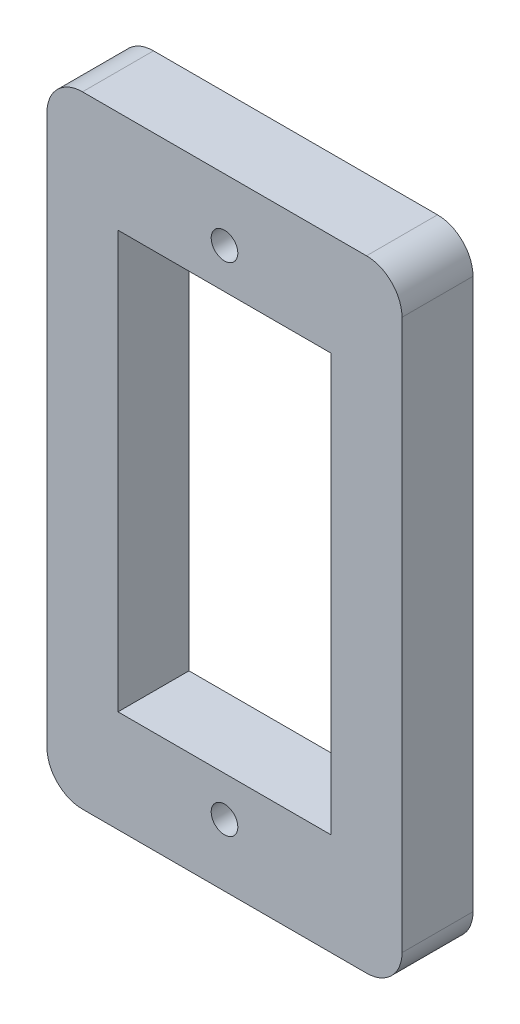
ISO-10303-21;
HEADER;
FILE_DESCRIPTION(('STEP AP214'),'2;1');
FILE_NAME('part.step','',(''),(''),'','','');
FILE_SCHEMA(('AUTOMOTIVE_DESIGN { 1 0 10303 214 1 1 1 1 }'));
ENDSEC;
DATA;
#1=APPLICATION_CONTEXT('core data for automotive mechanical design processes');
#2=APPLICATION_PROTOCOL_DEFINITION('international standard','automotive_design',2000,#1);
#3=PRODUCT_CONTEXT('',#1,'mechanical');
#4=PRODUCT('Part','Part','',(#3));
#5=PRODUCT_RELATED_PRODUCT_CATEGORY('part','',(#4));
#6=PRODUCT_DEFINITION_FORMATION('','',#4);
#7=PRODUCT_DEFINITION_CONTEXT('part definition',#1,'design');
#8=PRODUCT_DEFINITION('design','',#6,#7);
#9=PRODUCT_DEFINITION_SHAPE('','',#8);
#10=(LENGTH_UNIT() NAMED_UNIT(*) SI_UNIT(.MILLI.,.METRE.));
#11=(NAMED_UNIT(*) PLANE_ANGLE_UNIT() SI_UNIT($,.RADIAN.));
#12=(NAMED_UNIT(*) SI_UNIT($,.STERADIAN.) SOLID_ANGLE_UNIT());
#13=UNCERTAINTY_MEASURE_WITH_UNIT(LENGTH_MEASURE(1.E-05),#10,'distance_accuracy_value','');
#14=(GEOMETRIC_REPRESENTATION_CONTEXT(3) GLOBAL_UNCERTAINTY_ASSIGNED_CONTEXT((#13)) GLOBAL_UNIT_ASSIGNED_CONTEXT((#10,
#11,#12)) REPRESENTATION_CONTEXT('',''));
#15=CARTESIAN_POINT('',(0.,0.,0.));
#16=DIRECTION('',(0.,0.,1.));
#17=DIRECTION('',(1.,0.,0.));
#18=AXIS2_PLACEMENT_3D('',#15,#16,#17);
#19=CARTESIAN_POINT('',(0.,0.,4.));
#20=DIRECTION('',(0.,0.,1.));
#21=DIRECTION('',(1.,0.,0.));
#22=AXIS2_PLACEMENT_3D('',#19,#20,#21);
#23=PLANE('',#22);
#24=CARTESIAN_POINT('',(0.,14.,4.));
#25=DIRECTION('',(0.,0.,1.));
#26=DIRECTION('',(1.,0.,0.));
#27=AXIS2_PLACEMENT_3D('',#24,#25,#26);
#28=CIRCLE('',#27,0.75);
#29=CARTESIAN_POINT('',(0.75,14.,4.));
#30=VERTEX_POINT('',#29);
#31=EDGE_CURVE('E441',#30,#30,#28,.T.);
#32=ORIENTED_EDGE('',*,*,#31,.F.);
#33=EDGE_LOOP('',(#32));
#34=FACE_BOUND('',#33,.T.);
#35=CARTESIAN_POINT('',(0.,-14.,4.));
#36=DIRECTION('',(0.,0.,1.));
#37=DIRECTION('',(-1.,0.,0.));
#38=AXIS2_PLACEMENT_3D('',#35,#36,#37);
#39=CIRCLE('',#38,0.75);
#40=CARTESIAN_POINT('',(-0.75,-14.,4.));
#41=VERTEX_POINT('',#40);
#42=EDGE_CURVE('E438',#41,#41,#39,.T.);
#43=ORIENTED_EDGE('',*,*,#42,.F.);
#44=EDGE_LOOP('',(#43));
#45=FACE_BOUND('',#44,.T.);
#46=DIRECTION('',(1.,0.,0.));
#47=VECTOR('',#46,1.);
#48=CARTESIAN_POINT('',(-10.,-17.5,4.));
#49=LINE('',#48,#47);
#50=CARTESIAN_POINT('',(-8.,-17.5,4.));
#51=VERTEX_POINT('',#50);
#52=CARTESIAN_POINT('',(8.,-17.5,4.));
#53=VERTEX_POINT('',#52);
#54=EDGE_CURVE('E197',#51,#53,#49,.T.);
#55=ORIENTED_EDGE('',*,*,#54,.T.);
#56=CARTESIAN_POINT('',(8.,-15.5,4.));
#57=DIRECTION('',(0.,0.,1.));
#58=DIRECTION('',(1.,0.,0.));
#59=AXIS2_PLACEMENT_3D('',#56,#57,#58);
#60=CIRCLE('',#59,2.);
#61=CARTESIAN_POINT('',(10.,-15.5,4.));
#62=VERTEX_POINT('',#61);
#63=EDGE_CURVE('E248',#53,#62,#60,.T.);
#64=ORIENTED_EDGE('',*,*,#63,.T.);
#65=DIRECTION('',(0.,1.,0.));
#66=VECTOR('',#65,1.);
#67=CARTESIAN_POINT('',(10.,17.5,4.));
#68=LINE('',#67,#66);
#69=CARTESIAN_POINT('',(10.,15.5,4.));
#70=VERTEX_POINT('',#69);
#71=EDGE_CURVE('E186',#62,#70,#68,.T.);
#72=ORIENTED_EDGE('',*,*,#71,.T.);
#73=CARTESIAN_POINT('',(8.,15.5,4.));
#74=DIRECTION('',(0.,0.,1.));
#75=DIRECTION('',(1.,0.,0.));
#76=AXIS2_PLACEMENT_3D('',#73,#74,#75);
#77=CIRCLE('',#76,2.);
#78=CARTESIAN_POINT('',(8.,17.5,4.));
#79=VERTEX_POINT('',#78);
#80=EDGE_CURVE('E240',#70,#79,#77,.T.);
#81=ORIENTED_EDGE('',*,*,#80,.T.);
#82=DIRECTION('',(-1.,0.,0.));
#83=VECTOR('',#82,1.);
#84=CARTESIAN_POINT('',(-10.,17.5,4.));
#85=LINE('',#84,#83);
#86=CARTESIAN_POINT('',(-8.,17.5,4.));
#87=VERTEX_POINT('',#86);
#88=EDGE_CURVE('E190',#79,#87,#85,.T.);
#89=ORIENTED_EDGE('',*,*,#88,.T.);
#90=CARTESIAN_POINT('',(-8.,15.5,4.));
#91=DIRECTION('',(0.,0.,1.));
#92=DIRECTION('',(1.,0.,0.));
#93=AXIS2_PLACEMENT_3D('',#90,#91,#92);
#94=CIRCLE('',#93,2.);
#95=CARTESIAN_POINT('',(-10.,15.5,4.));
#96=VERTEX_POINT('',#95);
#97=EDGE_CURVE('E62',#87,#96,#94,.T.);
#98=ORIENTED_EDGE('',*,*,#97,.T.);
#99=DIRECTION('',(0.,-1.,0.));
#100=VECTOR('',#99,1.);
#101=CARTESIAN_POINT('',(-10.,17.5,4.));
#102=LINE('',#101,#100);
#103=CARTESIAN_POINT('',(-10.,-15.5,4.));
#104=VERTEX_POINT('',#103);
#105=EDGE_CURVE('E194',#96,#104,#102,.T.);
#106=ORIENTED_EDGE('',*,*,#105,.T.);
#107=CARTESIAN_POINT('',(-8.,-15.5,4.));
#108=DIRECTION('',(0.,0.,1.));
#109=DIRECTION('',(1.,0.,0.));
#110=AXIS2_PLACEMENT_3D('',#107,#108,#109);
#111=CIRCLE('',#110,2.);
#112=EDGE_CURVE('E245',#104,#51,#111,.T.);
#113=ORIENTED_EDGE('',*,*,#112,.T.);
#114=EDGE_LOOP('',(#55,#64,#72,#81,#89,#98,#106,#113));
#115=FACE_BOUND('',#114,.T.);
#116=DIRECTION('',(-1.,0.,0.));
#117=VECTOR('',#116,1.);
#118=CARTESIAN_POINT('',(-6.,11.75,4.));
#119=LINE('',#118,#117);
#120=CARTESIAN_POINT('',(6.,11.75,4.));
#121=VERTEX_POINT('',#120);
#122=CARTESIAN_POINT('',(-6.,11.75,4.));
#123=VERTEX_POINT('',#122);
#124=EDGE_CURVE('E142',#121,#123,#119,.T.);
#125=ORIENTED_EDGE('',*,*,#124,.F.);
#126=DIRECTION('',(0.,1.,0.));
#127=VECTOR('',#126,1.);
#128=CARTESIAN_POINT('',(6.,11.75,4.));
#129=LINE('',#128,#127);
#130=CARTESIAN_POINT('',(6.,-11.75,4.));
#131=VERTEX_POINT('',#130);
#132=EDGE_CURVE('E131',#131,#121,#129,.T.);
#133=ORIENTED_EDGE('',*,*,#132,.F.);
#134=DIRECTION('',(1.,0.,0.));
#135=VECTOR('',#134,1.);
#136=CARTESIAN_POINT('',(-6.,-11.75,4.));
#137=LINE('',#136,#135);
#138=CARTESIAN_POINT('',(-6.,-11.75,4.));
#139=VERTEX_POINT('',#138);
#140=EDGE_CURVE('E160',#139,#131,#137,.T.);
#141=ORIENTED_EDGE('',*,*,#140,.F.);
#142=DIRECTION('',(0.,-1.,0.));
#143=VECTOR('',#142,1.);
#144=CARTESIAN_POINT('',(-6.,11.75,4.));
#145=LINE('',#144,#143);
#146=EDGE_CURVE('E156',#123,#139,#145,.T.);
#147=ORIENTED_EDGE('',*,*,#146,.F.);
#148=EDGE_LOOP('',(#125,#133,#141,#147));
#149=FACE_BOUND('',#148,.T.);
#150=ADVANCED_FACE('F39',(#34,#45,#115,#149),#23,.T.);
#151=CARTESIAN_POINT('',(0.,0.,0.));
#152=DIRECTION('',(0.,0.,1.));
#153=DIRECTION('',(1.,0.,0.));
#154=AXIS2_PLACEMENT_3D('',#151,#152,#153);
#155=PLANE('',#154);
#156=CARTESIAN_POINT('',(0.,14.,0.));
#157=DIRECTION('',(0.,0.,1.));
#158=DIRECTION('',(1.,0.,0.));
#159=AXIS2_PLACEMENT_3D('',#156,#157,#158);
#160=CIRCLE('',#159,0.75);
#161=CARTESIAN_POINT('',(0.75,14.,0.));
#162=VERTEX_POINT('',#161);
#163=EDGE_CURVE('E169',#162,#162,#160,.T.);
#164=ORIENTED_EDGE('',*,*,#163,.T.);
#165=EDGE_LOOP('',(#164));
#166=FACE_BOUND('',#165,.T.);
#167=CARTESIAN_POINT('',(0.,-14.,0.));
#168=DIRECTION('',(0.,0.,1.));
#169=DIRECTION('',(-1.,0.,0.));
#170=AXIS2_PLACEMENT_3D('',#167,#168,#169);
#171=CIRCLE('',#170,0.75);
#172=CARTESIAN_POINT('',(-0.75,-14.,0.));
#173=VERTEX_POINT('',#172);
#174=EDGE_CURVE('E435',#173,#173,#171,.T.);
#175=ORIENTED_EDGE('',*,*,#174,.T.);
#176=EDGE_LOOP('',(#175));
#177=FACE_BOUND('',#176,.T.);
#178=DIRECTION('',(0.,1.,0.));
#179=VECTOR('',#178,1.);
#180=CARTESIAN_POINT('',(10.,17.5,0.));
#181=LINE('',#180,#179);
#182=CARTESIAN_POINT('',(10.,-15.5,0.));
#183=VERTEX_POINT('',#182);
#184=CARTESIAN_POINT('',(10.,15.5,0.));
#185=VERTEX_POINT('',#184);
#186=EDGE_CURVE('E151',#183,#185,#181,.T.);
#187=ORIENTED_EDGE('',*,*,#186,.F.);
#188=CARTESIAN_POINT('',(8.,-15.5,0.));
#189=DIRECTION('',(0.,0.,1.));
#190=DIRECTION('',(1.,0.,0.));
#191=AXIS2_PLACEMENT_3D('',#188,#189,#190);
#192=CIRCLE('',#191,2.);
#193=CARTESIAN_POINT('',(8.,-17.5,0.));
#194=VERTEX_POINT('',#193);
#195=EDGE_CURVE('E230',#183,#194,#192,.F.);
#196=ORIENTED_EDGE('',*,*,#195,.T.);
#197=DIRECTION('',(1.,0.,0.));
#198=VECTOR('',#197,1.);
#199=CARTESIAN_POINT('',(-10.,-17.5,0.));
#200=LINE('',#199,#198);
#201=CARTESIAN_POINT('',(-8.,-17.5,0.));
#202=VERTEX_POINT('',#201);
#203=EDGE_CURVE('E191',#202,#194,#200,.T.);
#204=ORIENTED_EDGE('',*,*,#203,.F.);
#205=CARTESIAN_POINT('',(-8.,-15.5,0.));
#206=DIRECTION('',(0.,0.,1.));
#207=DIRECTION('',(1.,0.,0.));
#208=AXIS2_PLACEMENT_3D('',#205,#206,#207);
#209=CIRCLE('',#208,2.);
#210=CARTESIAN_POINT('',(-10.,-15.5,0.));
#211=VERTEX_POINT('',#210);
#212=EDGE_CURVE('E227',#202,#211,#209,.F.);
#213=ORIENTED_EDGE('',*,*,#212,.T.);
#214=DIRECTION('',(0.,-1.,0.));
#215=VECTOR('',#214,1.);
#216=CARTESIAN_POINT('',(-10.,17.5,0.));
#217=LINE('',#216,#215);
#218=CARTESIAN_POINT('',(-10.,15.5,0.));
#219=VERTEX_POINT('',#218);
#220=EDGE_CURVE('E209',#219,#211,#217,.T.);
#221=ORIENTED_EDGE('',*,*,#220,.F.);
#222=CARTESIAN_POINT('',(-8.,15.5,0.));
#223=DIRECTION('',(0.,0.,1.));
#224=DIRECTION('',(1.,0.,0.));
#225=AXIS2_PLACEMENT_3D('',#222,#223,#224);
#226=CIRCLE('',#225,2.);
#227=CARTESIAN_POINT('',(-8.,17.5,0.));
#228=VERTEX_POINT('',#227);
#229=EDGE_CURVE('E224',#219,#228,#226,.F.);
#230=ORIENTED_EDGE('',*,*,#229,.T.);
#231=DIRECTION('',(-1.,0.,0.));
#232=VECTOR('',#231,1.);
#233=CARTESIAN_POINT('',(-10.,17.5,0.));
#234=LINE('',#233,#232);
#235=CARTESIAN_POINT('',(8.,17.5,0.));
#236=VERTEX_POINT('',#235);
#237=EDGE_CURVE('E205',#236,#228,#234,.T.);
#238=ORIENTED_EDGE('',*,*,#237,.F.);
#239=CARTESIAN_POINT('',(8.,15.5,0.));
#240=DIRECTION('',(0.,0.,1.));
#241=DIRECTION('',(1.,0.,0.));
#242=AXIS2_PLACEMENT_3D('',#239,#240,#241);
#243=CIRCLE('',#242,2.);
#244=EDGE_CURVE('E221',#236,#185,#243,.F.);
#245=ORIENTED_EDGE('',*,*,#244,.T.);
#246=EDGE_LOOP('',(#187,#196,#204,#213,#221,#230,#238,#245));
#247=FACE_BOUND('',#246,.T.);
#248=DIRECTION('',(0.,1.,0.));
#249=VECTOR('',#248,1.);
#250=CARTESIAN_POINT('',(6.,11.75,0.));
#251=LINE('',#250,#249);
#252=CARTESIAN_POINT('',(6.,-11.75,0.));
#253=VERTEX_POINT('',#252);
#254=CARTESIAN_POINT('',(6.,11.75,0.));
#255=VERTEX_POINT('',#254);
#256=EDGE_CURVE('E166',#253,#255,#251,.T.);
#257=ORIENTED_EDGE('',*,*,#256,.T.);
#258=DIRECTION('',(-1.,0.,0.));
#259=VECTOR('',#258,1.);
#260=CARTESIAN_POINT('',(-6.,11.75,0.));
#261=LINE('',#260,#259);
#262=CARTESIAN_POINT('',(-6.,11.75,0.));
#263=VERTEX_POINT('',#262);
#264=EDGE_CURVE('E149',#255,#263,#261,.T.);
#265=ORIENTED_EDGE('',*,*,#264,.T.);
#266=DIRECTION('',(0.,-1.,0.));
#267=VECTOR('',#266,1.);
#268=CARTESIAN_POINT('',(-6.,11.75,0.));
#269=LINE('',#268,#267);
#270=CARTESIAN_POINT('',(-6.,-11.75,0.));
#271=VERTEX_POINT('',#270);
#272=EDGE_CURVE('E172',#263,#271,#269,.T.);
#273=ORIENTED_EDGE('',*,*,#272,.T.);
#274=DIRECTION('',(1.,0.,0.));
#275=VECTOR('',#274,1.);
#276=CARTESIAN_POINT('',(-6.,-11.75,0.));
#277=LINE('',#276,#275);
#278=EDGE_CURVE('E143',#271,#253,#277,.T.);
#279=ORIENTED_EDGE('',*,*,#278,.T.);
#280=EDGE_LOOP('',(#257,#265,#273,#279));
#281=FACE_BOUND('',#280,.T.);
#282=ADVANCED_FACE('F268',(#166,#177,#247,#281),#155,.F.);
#283=CARTESIAN_POINT('',(10.,17.5,4.));
#284=DIRECTION('',(-1.,0.,0.));
#285=DIRECTION('',(0.,-1.,0.));
#286=AXIS2_PLACEMENT_3D('',#283,#284,#285);
#287=PLANE('',#286);
#288=ORIENTED_EDGE('',*,*,#71,.F.);
#289=DIRECTION('',(0.,0.,-1.));
#290=VECTOR('',#289,1.);
#291=CARTESIAN_POINT('',(10.,-15.5,4.));
#292=LINE('',#291,#290);
#293=EDGE_CURVE('E217',#62,#183,#292,.T.);
#294=ORIENTED_EDGE('',*,*,#293,.T.);
#295=ORIENTED_EDGE('',*,*,#186,.T.);
#296=DIRECTION('',(0.,0.,-1.));
#297=VECTOR('',#296,1.);
#298=CARTESIAN_POINT('',(10.,15.5,4.));
#299=LINE('',#298,#297);
#300=EDGE_CURVE('E201',#185,#70,#299,.F.);
#301=ORIENTED_EDGE('',*,*,#300,.T.);
#302=EDGE_LOOP('',(#288,#294,#295,#301));
#303=FACE_BOUND('',#302,.T.);
#304=ADVANCED_FACE('F290',(#303),#287,.F.);
#305=CARTESIAN_POINT('',(-10.,17.5,4.));
#306=DIRECTION('',(0.,-1.,0.));
#307=DIRECTION('',(0.,0.,-1.));
#308=AXIS2_PLACEMENT_3D('',#305,#306,#307);
#309=PLANE('',#308);
#310=ORIENTED_EDGE('',*,*,#237,.T.);
#311=DIRECTION('',(0.,0.,-1.));
#312=VECTOR('',#311,1.);
#313=CARTESIAN_POINT('',(-8.,17.5,4.));
#314=LINE('',#313,#312);
#315=EDGE_CURVE('E11',#228,#87,#314,.F.);
#316=ORIENTED_EDGE('',*,*,#315,.T.);
#317=ORIENTED_EDGE('',*,*,#88,.F.);
#318=DIRECTION('',(0.,0.,-1.));
#319=VECTOR('',#318,1.);
#320=CARTESIAN_POINT('',(8.,17.5,4.));
#321=LINE('',#320,#319);
#322=EDGE_CURVE('E48',#79,#236,#321,.T.);
#323=ORIENTED_EDGE('',*,*,#322,.T.);
#324=EDGE_LOOP('',(#310,#316,#317,#323));
#325=FACE_BOUND('',#324,.T.);
#326=ADVANCED_FACE('F262',(#325),#309,.F.);
#327=CARTESIAN_POINT('',(-10.,17.5,4.));
#328=DIRECTION('',(1.,0.,0.));
#329=DIRECTION('',(0.,1.,0.));
#330=AXIS2_PLACEMENT_3D('',#327,#328,#329);
#331=PLANE('',#330);
#332=ORIENTED_EDGE('',*,*,#220,.T.);
#333=DIRECTION('',(0.,0.,-1.));
#334=VECTOR('',#333,1.);
#335=CARTESIAN_POINT('',(-10.,-15.5,4.));
#336=LINE('',#335,#334);
#337=EDGE_CURVE('E55',#211,#104,#336,.F.);
#338=ORIENTED_EDGE('',*,*,#337,.T.);
#339=ORIENTED_EDGE('',*,*,#105,.F.);
#340=DIRECTION('',(0.,0.,-1.));
#341=VECTOR('',#340,1.);
#342=CARTESIAN_POINT('',(-10.,15.5,4.));
#343=LINE('',#342,#341);
#344=EDGE_CURVE('E251',#96,#219,#343,.T.);
#345=ORIENTED_EDGE('',*,*,#344,.T.);
#346=EDGE_LOOP('',(#332,#338,#339,#345));
#347=FACE_BOUND('',#346,.T.);
#348=ADVANCED_FACE('F274',(#347),#331,.F.);
#349=CARTESIAN_POINT('',(-10.,-17.5,4.));
#350=DIRECTION('',(0.,1.,0.));
#351=DIRECTION('',(0.,0.,1.));
#352=AXIS2_PLACEMENT_3D('',#349,#350,#351);
#353=PLANE('',#352);
#354=ORIENTED_EDGE('',*,*,#203,.T.);
#355=DIRECTION('',(0.,0.,-1.));
#356=VECTOR('',#355,1.);
#357=CARTESIAN_POINT('',(8.,-17.5,4.));
#358=LINE('',#357,#356);
#359=EDGE_CURVE('E237',#194,#53,#358,.F.);
#360=ORIENTED_EDGE('',*,*,#359,.T.);
#361=ORIENTED_EDGE('',*,*,#54,.F.);
#362=DIRECTION('',(0.,0.,-1.));
#363=VECTOR('',#362,1.);
#364=CARTESIAN_POINT('',(-8.,-17.5,4.));
#365=LINE('',#364,#363);
#366=EDGE_CURVE('E233',#51,#202,#365,.T.);
#367=ORIENTED_EDGE('',*,*,#366,.T.);
#368=EDGE_LOOP('',(#354,#360,#361,#367));
#369=FACE_BOUND('',#368,.T.);
#370=ADVANCED_FACE('F282',(#369),#353,.F.);
#371=CARTESIAN_POINT('',(6.,11.75,4.));
#372=DIRECTION('',(-1.,0.,0.));
#373=DIRECTION('',(0.,-1.,0.));
#374=AXIS2_PLACEMENT_3D('',#371,#372,#373);
#375=PLANE('',#374);
#376=ORIENTED_EDGE('',*,*,#256,.F.);
#377=DIRECTION('',(0.,0.,-1.));
#378=VECTOR('',#377,1.);
#379=CARTESIAN_POINT('',(6.,-11.75,4.));
#380=LINE('',#379,#378);
#381=EDGE_CURVE('E137',#131,#253,#380,.T.);
#382=ORIENTED_EDGE('',*,*,#381,.F.);
#383=ORIENTED_EDGE('',*,*,#132,.T.);
#384=DIRECTION('',(0.,0.,-1.));
#385=VECTOR('',#384,1.);
#386=CARTESIAN_POINT('',(6.,11.75,4.));
#387=LINE('',#386,#385);
#388=EDGE_CURVE('E134',#121,#255,#387,.T.);
#389=ORIENTED_EDGE('',*,*,#388,.T.);
#390=EDGE_LOOP('',(#376,#382,#383,#389));
#391=FACE_BOUND('',#390,.T.);
#392=ADVANCED_FACE('F133',(#391),#375,.T.);
#393=CARTESIAN_POINT('',(-6.,11.75,4.));
#394=DIRECTION('',(0.,-1.,0.));
#395=DIRECTION('',(1.,0.,0.));
#396=AXIS2_PLACEMENT_3D('',#393,#394,#395);
#397=PLANE('',#396);
#398=ORIENTED_EDGE('',*,*,#264,.F.);
#399=ORIENTED_EDGE('',*,*,#388,.F.);
#400=ORIENTED_EDGE('',*,*,#124,.T.);
#401=DIRECTION('',(0.,0.,-1.));
#402=VECTOR('',#401,1.);
#403=CARTESIAN_POINT('',(-6.,11.75,4.));
#404=LINE('',#403,#402);
#405=EDGE_CURVE('E152',#123,#263,#404,.T.);
#406=ORIENTED_EDGE('',*,*,#405,.T.);
#407=EDGE_LOOP('',(#398,#399,#400,#406));
#408=FACE_BOUND('',#407,.T.);
#409=ADVANCED_FACE('F146',(#408),#397,.T.);
#410=CARTESIAN_POINT('',(-6.,11.75,4.));
#411=DIRECTION('',(1.,0.,0.));
#412=DIRECTION('',(0.,1.,0.));
#413=AXIS2_PLACEMENT_3D('',#410,#411,#412);
#414=PLANE('',#413);
#415=ORIENTED_EDGE('',*,*,#272,.F.);
#416=ORIENTED_EDGE('',*,*,#405,.F.);
#417=ORIENTED_EDGE('',*,*,#146,.T.);
#418=DIRECTION('',(0.,0.,-1.));
#419=VECTOR('',#418,1.);
#420=CARTESIAN_POINT('',(-6.,-11.75,4.));
#421=LINE('',#420,#419);
#422=EDGE_CURVE('E181',#139,#271,#421,.T.);
#423=ORIENTED_EDGE('',*,*,#422,.T.);
#424=EDGE_LOOP('',(#415,#416,#417,#423));
#425=FACE_BOUND('',#424,.T.);
#426=ADVANCED_FACE('F368',(#425),#414,.T.);
#427=CARTESIAN_POINT('',(-6.,-11.75,4.));
#428=DIRECTION('',(0.,1.,0.));
#429=DIRECTION('',(0.,0.,1.));
#430=AXIS2_PLACEMENT_3D('',#427,#428,#429);
#431=PLANE('',#430);
#432=ORIENTED_EDGE('',*,*,#278,.F.);
#433=ORIENTED_EDGE('',*,*,#422,.F.);
#434=ORIENTED_EDGE('',*,*,#140,.T.);
#435=ORIENTED_EDGE('',*,*,#381,.T.);
#436=EDGE_LOOP('',(#432,#433,#434,#435));
#437=FACE_BOUND('',#436,.T.);
#438=ADVANCED_FACE('F359',(#437),#431,.T.);
#439=CARTESIAN_POINT('',(0.,-14.,0.));
#440=DIRECTION('',(0.,0.,1.));
#441=DIRECTION('',(1.,0.,0.));
#442=AXIS2_PLACEMENT_3D('',#439,#440,#441);
#443=CYLINDRICAL_SURFACE('',#442,0.75);
#444=ORIENTED_EDGE('',*,*,#174,.F.);
#445=EDGE_LOOP('',(#444));
#446=FACE_BOUND('',#445,.T.);
#447=ORIENTED_EDGE('',*,*,#42,.T.);
#448=EDGE_LOOP('',(#447));
#449=FACE_BOUND('',#448,.T.);
#450=ADVANCED_FACE('F350',(#446,#449),#443,.F.);
#451=CARTESIAN_POINT('',(0.,14.,0.));
#452=DIRECTION('',(0.,0.,1.));
#453=DIRECTION('',(1.,0.,0.));
#454=AXIS2_PLACEMENT_3D('',#451,#452,#453);
#455=CYLINDRICAL_SURFACE('',#454,0.75);
#456=ORIENTED_EDGE('',*,*,#163,.F.);
#457=EDGE_LOOP('',(#456));
#458=FACE_BOUND('',#457,.T.);
#459=ORIENTED_EDGE('',*,*,#31,.T.);
#460=EDGE_LOOP('',(#459));
#461=FACE_BOUND('',#460,.T.);
#462=ADVANCED_FACE('F319',(#458,#461),#455,.F.);
#463=CARTESIAN_POINT('',(8.,-15.5,4.));
#464=DIRECTION('',(0.,0.,-1.));
#465=DIRECTION('',(-1.,0.,0.));
#466=AXIS2_PLACEMENT_3D('',#463,#464,#465);
#467=CYLINDRICAL_SURFACE('',#466,2.);
#468=ORIENTED_EDGE('',*,*,#63,.F.);
#469=ORIENTED_EDGE('',*,*,#359,.F.);
#470=ORIENTED_EDGE('',*,*,#195,.F.);
#471=ORIENTED_EDGE('',*,*,#293,.F.);
#472=EDGE_LOOP('',(#468,#469,#470,#471));
#473=FACE_BOUND('',#472,.T.);
#474=ADVANCED_FACE('F287',(#473),#467,.T.);
#475=CARTESIAN_POINT('',(-8.,-15.5,4.));
#476=DIRECTION('',(0.,0.,-1.));
#477=DIRECTION('',(-1.,0.,0.));
#478=AXIS2_PLACEMENT_3D('',#475,#476,#477);
#479=CYLINDRICAL_SURFACE('',#478,2.);
#480=ORIENTED_EDGE('',*,*,#112,.F.);
#481=ORIENTED_EDGE('',*,*,#337,.F.);
#482=ORIENTED_EDGE('',*,*,#212,.F.);
#483=ORIENTED_EDGE('',*,*,#366,.F.);
#484=EDGE_LOOP('',(#480,#481,#482,#483));
#485=FACE_BOUND('',#484,.T.);
#486=ADVANCED_FACE('F279',(#485),#479,.T.);
#487=CARTESIAN_POINT('',(-8.,15.5,4.));
#488=DIRECTION('',(0.,0.,-1.));
#489=DIRECTION('',(-1.,0.,0.));
#490=AXIS2_PLACEMENT_3D('',#487,#488,#489);
#491=CYLINDRICAL_SURFACE('',#490,2.);
#492=ORIENTED_EDGE('',*,*,#97,.F.);
#493=ORIENTED_EDGE('',*,*,#315,.F.);
#494=ORIENTED_EDGE('',*,*,#229,.F.);
#495=ORIENTED_EDGE('',*,*,#344,.F.);
#496=EDGE_LOOP('',(#492,#493,#494,#495));
#497=FACE_BOUND('',#496,.T.);
#498=ADVANCED_FACE('F273',(#497),#491,.T.);
#499=CARTESIAN_POINT('',(8.,15.5,4.));
#500=DIRECTION('',(0.,0.,-1.));
#501=DIRECTION('',(-1.,0.,0.));
#502=AXIS2_PLACEMENT_3D('',#499,#500,#501);
#503=CYLINDRICAL_SURFACE('',#502,2.);
#504=ORIENTED_EDGE('',*,*,#80,.F.);
#505=ORIENTED_EDGE('',*,*,#300,.F.);
#506=ORIENTED_EDGE('',*,*,#244,.F.);
#507=ORIENTED_EDGE('',*,*,#322,.F.);
#508=EDGE_LOOP('',(#504,#505,#506,#507));
#509=FACE_BOUND('',#508,.T.);
#510=ADVANCED_FACE('F41',(#509),#503,.T.);
#511=CLOSED_SHELL('',(#150,#282,#304,#326,#348,#370,#392,#409,#426,#438,#450,#462,#474,#486,
#498,#510));
#512=MANIFOLD_SOLID_BREP('B2',#511);
#513=ADVANCED_BREP_SHAPE_REPRESENTATION('',(#18,#512),#14);
#514=SHAPE_DEFINITION_REPRESENTATION(#9,#513);
ENDSEC;
END-ISO-10303-21;
